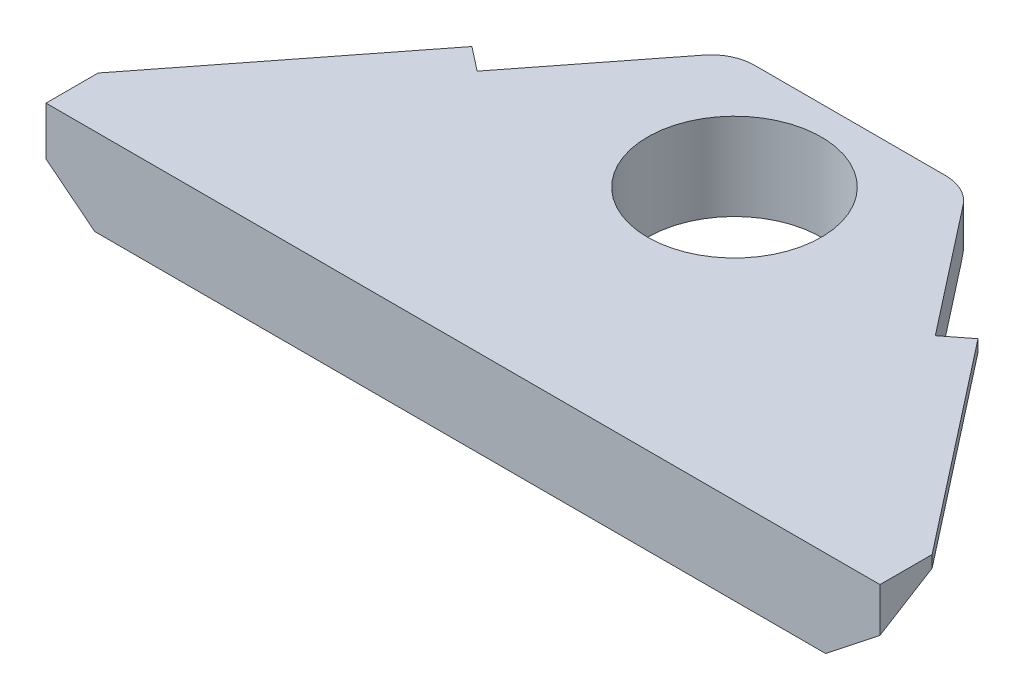
ISO-10303-21;
HEADER;
FILE_DESCRIPTION(('STEP AP214'),'2;1');
FILE_NAME('part.step','',(''),(''),'','','');
FILE_SCHEMA(('AUTOMOTIVE_DESIGN { 1 0 10303 214 1 1 1 1 }'));
ENDSEC;
DATA;
#1=APPLICATION_CONTEXT('core data for automotive mechanical design processes');
#2=APPLICATION_PROTOCOL_DEFINITION('international standard','automotive_design',2000,#1);
#3=PRODUCT_CONTEXT('',#1,'mechanical');
#4=PRODUCT('Part','Part','',(#3));
#5=PRODUCT_RELATED_PRODUCT_CATEGORY('part','',(#4));
#6=PRODUCT_DEFINITION_FORMATION('','',#4);
#7=PRODUCT_DEFINITION_CONTEXT('part definition',#1,'design');
#8=PRODUCT_DEFINITION('design','',#6,#7);
#9=PRODUCT_DEFINITION_SHAPE('','',#8);
#10=(LENGTH_UNIT() NAMED_UNIT(*) SI_UNIT(.MILLI.,.METRE.));
#11=(NAMED_UNIT(*) PLANE_ANGLE_UNIT() SI_UNIT($,.RADIAN.));
#12=(NAMED_UNIT(*) SI_UNIT($,.STERADIAN.) SOLID_ANGLE_UNIT());
#13=UNCERTAINTY_MEASURE_WITH_UNIT(LENGTH_MEASURE(1.E-05),#10,'distance_accuracy_value','');
#14=(GEOMETRIC_REPRESENTATION_CONTEXT(3) GLOBAL_UNCERTAINTY_ASSIGNED_CONTEXT((#13)) GLOBAL_UNIT_ASSIGNED_CONTEXT((#10,
#11,#12)) REPRESENTATION_CONTEXT('',''));
#15=CARTESIAN_POINT('',(0.,0.,0.));
#16=DIRECTION('',(0.,0.,1.));
#17=DIRECTION('',(1.,0.,0.));
#18=AXIS2_PLACEMENT_3D('',#15,#16,#17);
#19=CARTESIAN_POINT('',(-1.12413996809503E-13,20.,-89.1031036090809));
#20=DIRECTION('',(0.,0.,-1.));
#21=DIRECTION('',(-1.,0.,0.));
#22=AXIS2_PLACEMENT_3D('',#19,#20,#21);
#23=PLANE('',#22);
#24=DIRECTION('',(0.,-1.,0.));
#25=VECTOR('',#24,1.);
#26=CARTESIAN_POINT('',(22.,20.,-89.103103609081));
#27=LINE('',#26,#25);
#28=CARTESIAN_POINT('',(22.,20.,-89.103103609081));
#29=VERTEX_POINT('',#28);
#30=CARTESIAN_POINT('',(22.,8.31058830937253,-89.103103609081));
#31=VERTEX_POINT('',#30);
#32=EDGE_CURVE('E208',#29,#31,#27,.T.);
#33=ORIENTED_EDGE('',*,*,#32,.T.);
#34=CARTESIAN_POINT('',(22.,8.31058830937254,-89.1031036090809));
#35=CARTESIAN_POINT('',(21.5516868903119,8.05766600494873,-89.103103609081));
#36=CARTESIAN_POINT('',(21.1011796896838,7.80859694560279,-89.103103609081));
#37=CARTESIAN_POINT('',(20.1943695706919,7.31838547720371,-89.103103609081));
#38=CARTESIAN_POINT('',(19.7380546743511,7.07726523999198,-89.103103609081));
#39=CARTESIAN_POINT('',(18.8197680662028,6.60409199295412,-89.103103609081));
#40=CARTESIAN_POINT('',(18.3577881405278,6.37205489258515,-89.103103609081));
#41=CARTESIAN_POINT('',(17.42829004029,5.91825627754604,-89.103103609081));
#42=CARTESIAN_POINT('',(16.9607672899182,5.69650412074156,-89.1031036090809));
#43=CARTESIAN_POINT('',(16.0202806759605,5.26452050695447,-89.1031036090809));
#44=CARTESIAN_POINT('',(15.5473155061306,5.05429188860836,-89.1031036090809));
#45=CARTESIAN_POINT('',(14.5893472368671,4.64378122629533,-89.1031036090809));
#46=CARTESIAN_POINT('',(14.1042680729476,4.44367628543136,-89.1031036090809));
#47=CARTESIAN_POINT('',(13.1286445249615,4.0580055936524,-89.1031036090809));
#48=CARTESIAN_POINT('',(12.6381031386555,3.87243227724083,-89.1031036090809));
#49=CARTESIAN_POINT('',(11.6516051161092,3.51722856909518,-89.1031036090809));
#50=CARTESIAN_POINT('',(11.1556519732731,3.34758850144394,-89.1031036090809));
#51=CARTESIAN_POINT('',(10.1583774444303,3.02566952124503,-89.1031036090809));
#52=CARTESIAN_POINT('',(9.65705861721339,2.87338270439382,-89.1031036090809));
#53=CARTESIAN_POINT('',(8.64909839127432,2.58758389839375,-89.103103609081));
#54=CARTESIAN_POINT('',(8.14245719327166,2.45407120393947,-89.103103609081));
#55=CARTESIAN_POINT('',(7.15362276805173,2.21440771807101,-89.103103609081));
#56=CARTESIAN_POINT('',(6.67170492434744,2.10712290191107,-89.103103609081));
#57=CARTESIAN_POINT('',(5.70390001426596,1.91167513723405,-89.1031036090809));
#58=CARTESIAN_POINT('',(5.21801223189991,1.82351572071691,-89.1031036090809));
#59=CARTESIAN_POINT('',(4.24300686730657,1.66738982252561,-89.1031036090809));
#60=CARTESIAN_POINT('',(3.75388938192695,1.59942273813876,-89.1031036090809));
#61=CARTESIAN_POINT('',(2.77319701252768,1.48454224188554,-89.1031036090809));
#62=CARTESIAN_POINT('',(2.28162222129823,1.43762804102463,-89.1031036090809));
#63=CARTESIAN_POINT('',(1.30039407269518,1.36573414277388,-89.1031036090809));
#64=CARTESIAN_POINT('',(0.810752049927647,1.34060025240523,-89.1031036090809));
#65=CARTESIAN_POINT('',(-0.169210108173317,1.31204190772287,-89.1031036090809));
#66=CARTESIAN_POINT('',(-0.659530298825745,1.30861934339358,-89.1031036090809));
#67=CARTESIAN_POINT('',(-1.63983560734517,1.32353599176859,-89.1031036090809));
#68=CARTESIAN_POINT('',(-2.12982072694643,1.3418750909725,-89.103103609081));
#69=CARTESIAN_POINT('',(-3.10844785810192,1.40005983310495,-89.1031036090809));
#70=CARTESIAN_POINT('',(-3.59709002505045,1.43990287255807,-89.1031036090808));
#71=CARTESIAN_POINT('',(-4.57080475138942,1.54041804372604,-89.1031036090808));
#72=CARTESIAN_POINT('',(-5.05588352596649,1.60103019640312,-89.1031036090809));
#73=CARTESIAN_POINT('',(-6.02314438434832,1.74234635731469,-89.1031036090809));
#74=CARTESIAN_POINT('',(-6.50532616764961,1.82305241424924,-89.1031036090809));
#75=CARTESIAN_POINT('',(-7.46607724482037,2.00359416431994,-89.1031036090809));
#76=CARTESIAN_POINT('',(-7.94464660990237,2.10342947932709,-89.1031036090809));
#77=CARTESIAN_POINT('',(-8.89768154452408,2.32113554236395,-89.1031036090809));
#78=CARTESIAN_POINT('',(-9.37214673242462,2.43900794897773,-89.1031036090809));
#79=CARTESIAN_POINT('',(-10.7939522737905,2.81931379316332,-89.1031036090809));
#80=CARTESIAN_POINT('',(-11.7344985161579,3.10743590478535,-89.1031036090809));
#81=CARTESIAN_POINT('',(-13.5953892315399,3.74191515827093,-89.1031036090809));
#82=CARTESIAN_POINT('',(-14.515734930398,4.08826875532519,-89.1031036090809));
#83=CARTESIAN_POINT('',(-15.9911064465467,4.68925138008167,-89.1031036090809));
#84=CARTESIAN_POINT('',(-16.5523288638852,4.92886247233152,-89.1031036090809));
#85=CARTESIAN_POINT('',(-17.667207660377,5.42491764430541,-89.1031036090809));
#86=CARTESIAN_POINT('',(-18.2208649115035,5.681359763944,-89.1031036090809));
#87=CARTESIAN_POINT('',(-19.3159614709003,6.20685615065486,-89.1031036090809));
#88=CARTESIAN_POINT('',(-19.8574660490442,6.47577493182386,-89.1031036090809));
#89=CARTESIAN_POINT('',(-20.9337105379841,7.02677988366636,-89.1031036090809));
#90=CARTESIAN_POINT('',(-21.4684507509953,7.30886546341989,-89.1031036090809));
#91=CARTESIAN_POINT('',(-22.,7.596762738856,-89.1031036090809));
#92=B_SPLINE_CURVE_WITH_KNOTS('',3,(#34,#35,#36,#37,#38,#39,#40,#41,#42,#43,#44,#45,#46,#47,#48,
#49,#50,#51,#52,#53,#54,#55,#56,#57,#58,#59,#60,#61,#62,#63,#64,#65,#66,#67,#68,#69,#70,#71,#72,
#73,#74,#75,#76,#77,#78,#79,#80,#81,#82,#83,#84,#85,#86,#87,#88,#89,#90,#91),.UNSPECIFIED.,.F.,
.F.,(4,2,2,2,2,2,2,2,2,2,2,2,2,2,2,2,2,2,2,2,2,2,2,2,2,2,2,2,4),(0.,1.54421854399556,
3.0924317610474,4.64324534578247,6.19544333264359,7.74802197564017,9.3220069215869,
10.8951668901648,12.4673652507412,14.0388445972178,15.6102648906448,17.0910476897978,
18.5721037214584,20.0531155412388,21.5340718528106,23.0044560660705,24.4749682754326,
25.9454728152063,27.4157993613721,28.8819150525468,30.3481802847041,31.8144165361132,
33.280787695031,36.229388986439,39.1778108483309,41.0082464360839,42.838469234342,
44.6520921725371,46.4656337942687),.UNSPECIFIED.);
#93=CARTESIAN_POINT('',(-22.,7.59676273885601,-89.1031036090809));
#94=VERTEX_POINT('',#93);
#95=EDGE_CURVE('E337',#31,#94,#92,.T.);
#96=ORIENTED_EDGE('',*,*,#95,.T.);
#97=DIRECTION('',(0.,-1.,0.));
#98=VECTOR('',#97,1.);
#99=CARTESIAN_POINT('',(-22.,20.,-89.1031036090809));
#100=LINE('',#99,#98);
#101=CARTESIAN_POINT('',(-22.,20.,-89.1031036090809));
#102=VERTEX_POINT('',#101);
#103=EDGE_CURVE('E183',#102,#94,#100,.T.);
#104=ORIENTED_EDGE('',*,*,#103,.F.);
#105=DIRECTION('',(1.,0.,0.));
#106=VECTOR('',#105,1.);
#107=CARTESIAN_POINT('',(-1.12413996809503E-13,20.,-89.1031036090809));
#108=LINE('',#107,#106);
#109=EDGE_CURVE('E201',#102,#29,#108,.T.);
#110=ORIENTED_EDGE('',*,*,#109,.T.);
#111=EDGE_LOOP('',(#33,#96,#104,#110));
#112=FACE_BOUND('',#111,.T.);
#113=ADVANCED_FACE('F35',(#112),#23,.T.);
#114=CARTESIAN_POINT('',(-22.,20.,-79.103103609081));
#115=DIRECTION('',(0.,-1.,0.));
#116=DIRECTION('',(0.,0.,-1.));
#117=AXIS2_PLACEMENT_3D('',#114,#115,#116);
#118=CYLINDRICAL_SURFACE('',#117,9.99999999999996);
#119=ORIENTED_EDGE('',*,*,#103,.T.);
#120=CARTESIAN_POINT('',(-22.,7.59676273885604,-89.1031036090809));
#121=CARTESIAN_POINT('',(-22.15643262679,7.68149996294082,-89.1031058562871));
#122=CARTESIAN_POINT('',(-22.3138978579587,7.76436440666731,-89.0994328312014));
#123=CARTESIAN_POINT('',(-22.6306646345165,7.92613636200172,-89.0844569779342));
#124=CARTESIAN_POINT('',(-22.7899676970097,8.00504026647464,-89.0731473253131));
#125=CARTESIAN_POINT('',(-23.1099415912795,8.15854707675892,-89.0426139989256));
#126=CARTESIAN_POINT('',(-23.2706127682739,8.23314885773725,-89.0233882660208));
#127=CARTESIAN_POINT('',(-23.5937801322642,8.37814635655076,-88.9766375370304));
#128=CARTESIAN_POINT('',(-23.756281500861,8.44851541946785,-88.9490654501955));
#129=CARTESIAN_POINT('',(-24.0816718572253,8.58425058653898,-88.8854405741208));
#130=CARTESIAN_POINT('',(-24.2445607419611,8.64961789421105,-88.8493898335659));
#131=CARTESIAN_POINT('',(-24.5702245221862,8.77504882818991,-88.7686138718));
#132=CARTESIAN_POINT('',(-24.7329994238043,8.83511276553482,-88.7238891598024));
#133=CARTESIAN_POINT('',(-25.0588831489083,8.94998427325665,-88.6253088741702));
#134=CARTESIAN_POINT('',(-25.2219876869424,9.00475659543627,-88.5713979088625));
#135=CARTESIAN_POINT('',(-25.5468854282463,9.1083057390864,-88.454542483566));
#136=CARTESIAN_POINT('',(-25.7086784967113,9.15708195134228,-88.391597107072));
#137=CARTESIAN_POINT('',(-26.030267518421,9.24833248033579,-88.2566467278765));
#138=CARTESIAN_POINT('',(-26.1900633742669,9.2908064908213,-88.1846412852198));
#139=CARTESIAN_POINT('',(-26.5063042146611,9.36901132269758,-88.0319293736593));
#140=CARTESIAN_POINT('',(-26.662760068624,9.40476850733653,-87.9512589624878));
#141=CARTESIAN_POINT('',(-26.972250501057,9.46949986003697,-87.7811164427654));
#142=CARTESIAN_POINT('',(-27.1252851787173,9.49847422498435,-87.6916445898023));
#143=CARTESIAN_POINT('',(-27.4271873303736,9.54942595724056,-87.5041277771909));
#144=CARTESIAN_POINT('',(-27.5760554000586,9.57140432945694,-87.4060840513916));
#145=CARTESIAN_POINT('',(-27.8573811892386,9.6067531108895,-87.2097765738068));
#146=CARTESIAN_POINT('',(-27.9902079301624,9.62066515471416,-87.1121383491966));
#147=CARTESIAN_POINT('',(-28.2511779389863,9.64232276860949,-86.9101515698974));
#148=CARTESIAN_POINT('',(-28.379321338654,9.65006851229904,-86.8058032042293));
#149=CARTESIAN_POINT('',(-28.6304048546391,9.65934140862808,-86.5907636007179));
#150=CARTESIAN_POINT('',(-28.7533449782892,9.66086857003142,-86.4800723718138));
#151=CARTESIAN_POINT('',(-28.994603455173,9.65768056126977,-86.2517644738187));
#152=CARTESIAN_POINT('',(-29.1128713333717,9.65291007907728,-86.1340952255674));
#153=CARTESIAN_POINT('',(-29.3431819345235,9.63705999888606,-85.8932018162863));
#154=CARTESIAN_POINT('',(-29.4552240809166,9.62597981761629,-85.7699771426806));
#155=CARTESIAN_POINT('',(-29.6727126783481,9.59759148671618,-85.518490179496));
#156=CARTESIAN_POINT('',(-29.7781580628011,9.58028233300486,-85.3902270807179));
#157=CARTESIAN_POINT('',(-29.8801075360672,9.55990129085186,-85.2597183623375));
#158=B_SPLINE_CURVE_WITH_KNOTS('',3,(#120,#121,#122,#123,#124,#125,#126,#127,#128,#129,#130,
#131,#132,#133,#134,#135,#136,#137,#138,#139,#140,#141,#142,#143,#144,#145,#146,#147,#148,#149,
#150,#151,#152,#153,#154,#155,#156,#157),.UNSPECIFIED.,.F.,.F.,(4,2,2,2,2,2,2,2,2,2,2,2,2,2,2,2,
2,2,4),(0.,0.533699589425553,1.06787674953373,1.60219294818595,2.13958183781984,2.6768410121083,
3.21406865564927,3.75465841240523,4.29530304865425,4.83597394864265,5.37447624773547,
5.91296291370445,6.45137219626471,6.94737570355834,7.44336524484069,7.93935408712499,
8.43972829952873,8.94014877422919,9.44064995050896),.UNSPECIFIED.);
#159=CARTESIAN_POINT('',(-29.8801075360672,9.55990129085187,-85.2597183623375));
#160=VERTEX_POINT('',#159);
#161=EDGE_CURVE('E282',#94,#160,#158,.T.);
#162=ORIENTED_EDGE('',*,*,#161,.T.);
#163=DIRECTION('',(0.,-1.,0.));
#164=VECTOR('',#163,1.);
#165=CARTESIAN_POINT('',(-29.8801075360672,20.,-85.2597183623375));
#166=LINE('',#165,#164);
#167=CARTESIAN_POINT('',(-29.8801075360672,20.,-85.2597183623375));
#168=VERTEX_POINT('',#167);
#169=EDGE_CURVE('E180',#168,#160,#166,.T.);
#170=ORIENTED_EDGE('',*,*,#169,.F.);
#171=CARTESIAN_POINT('',(-22.,20.,-79.103103609081));
#172=DIRECTION('',(0.,1.,0.));
#173=DIRECTION('',(0.,0.,1.));
#174=AXIS2_PLACEMENT_3D('',#171,#172,#173);
#175=CIRCLE('',#174,9.99999999999996);
#176=EDGE_CURVE('E242',#168,#102,#175,.F.);
#177=ORIENTED_EDGE('',*,*,#176,.T.);
#178=EDGE_LOOP('',(#119,#162,#170,#177));
#179=FACE_BOUND('',#178,.T.);
#180=ADVANCED_FACE('F280',(#179),#118,.T.);
#181=CARTESIAN_POINT('',(-59.9179500711928,20.,-46.8130331603703));
#182=DIRECTION('',(-0.788010753606721,0.,-0.615661475325659));
#183=DIRECTION('',(-0.615661475325659,0.,0.788010753606721));
#184=AXIS2_PLACEMENT_3D('',#181,#182,#183);
#185=PLANE('',#184);
#186=ORIENTED_EDGE('',*,*,#169,.T.);
#187=CARTESIAN_POINT('',(-29.8801075360672,9.5599012908519,-85.2597183623375));
#188=CARTESIAN_POINT('',(-29.989486319304,9.53804466760884,-85.1197199039941));
#189=CARTESIAN_POINT('',(-30.0989493815241,9.51729867291096,-84.9796135734713));
#190=CARTESIAN_POINT('',(-30.3179559444161,9.47806222493247,-84.6992979559023));
#191=CARTESIAN_POINT('',(-30.4274993452701,9.459570301498,-84.5590887966172));
#192=CARTESIAN_POINT('',(-30.6466674588731,9.42485619250329,-84.2785664035675));
#193=CARTESIAN_POINT('',(-30.7562921041109,9.40863288296598,-84.1382532562133));
#194=CARTESIAN_POINT('',(-30.9756233695458,9.37846861589302,-83.8575220383417));
#195=CARTESIAN_POINT('',(-31.0853299499413,9.36452689504534,-83.7171040187678));
#196=CARTESIAN_POINT('',(-31.3048257393703,9.33893755462954,-83.4361622197866));
#197=CARTESIAN_POINT('',(-31.4146149311578,9.32728954492146,-83.295638462453));
#198=CARTESIAN_POINT('',(-31.6342781559078,9.30629812157011,-83.0144823560337));
#199=CARTESIAN_POINT('',(-31.7441521898835,9.2969547358891,-82.8738500056512));
#200=CARTESIAN_POINT('',(-31.9639835322314,9.28058241555342,-82.5924787185192));
#201=CARTESIAN_POINT('',(-32.0739408512423,9.27355385763578,-82.4517397681528));
#202=CARTESIAN_POINT('',(-32.2939388900874,9.2618196147343,-82.1701551192341));
#203=CARTESIAN_POINT('',(-32.4039796254782,9.2571146989572,-82.0293094007703));
#204=CARTESIAN_POINT('',(-32.6241446139429,9.25003520450631,-81.747511066083));
#205=CARTESIAN_POINT('',(-32.7342688812521,9.24766179334452,-81.6065584316392));
#206=CARTESIAN_POINT('',(-32.9546010265122,9.24525084971135,-81.3245461460104));
#207=CARTESIAN_POINT('',(-33.0648089109692,9.24521488619569,-81.1834864864979));
#208=CARTESIAN_POINT('',(-33.1750122410625,9.24634995978794,-81.0424326563053));
#209=B_SPLINE_CURVE_WITH_KNOTS('',3,(#187,#188,#189,#190,#191,#192,#193,#194,#195,#196,#197,
#198,#199,#200,#201,#202,#203,#204,#205,#206,#207,#208),.UNSPECIFIED.,.F.,.F.,(4,2,2,2,2,2,2,2,
2,2,4),(0.,0.5369968662186,1.07364159589294,1.61001949752742,2.14621758392513,2.68232438884775,
3.21843769809506,3.75463821644629,4.29101611713117,4.8276624748869,5.36466903993515),.UNSPECIFIED.);
#210=CARTESIAN_POINT('',(-33.1750122410625,9.2463499597879,-81.0424326563053));
#211=VERTEX_POINT('',#210);
#212=EDGE_CURVE('E286',#160,#211,#209,.T.);
#213=ORIENTED_EDGE('',*,*,#212,.T.);
#214=DIRECTION('',(-0.615661475325659,0.,0.788010753606721));
#215=VECTOR('',#214,1.);
#216=CARTESIAN_POINT('',(-59.9179500711929,9.24634995978806,-46.8130331603702));
#217=LINE('',#216,#215);
#218=CARTESIAN_POINT('',(-52.7403049281963,9.24634995978801,-56.));
#219=VERTEX_POINT('',#218);
#220=EDGE_CURVE('E302',#211,#219,#217,.T.);
#221=ORIENTED_EDGE('',*,*,#220,.T.);
#222=DIRECTION('',(0.,-1.,0.));
#223=VECTOR('',#222,1.);
#224=CARTESIAN_POINT('',(-52.7403049281963,20.,-56.));
#225=LINE('',#224,#223);
#226=CARTESIAN_POINT('',(-52.7403049281963,20.,-56.));
#227=VERTEX_POINT('',#226);
#228=EDGE_CURVE('E177',#227,#219,#225,.T.);
#229=ORIENTED_EDGE('',*,*,#228,.F.);
#230=DIRECTION('',(0.615661475325659,0.,-0.788010753606721));
#231=VECTOR('',#230,1.);
#232=CARTESIAN_POINT('',(-59.9179500711928,20.,-46.8130331603703));
#233=LINE('',#232,#231);
#234=EDGE_CURVE('E245',#227,#168,#233,.T.);
#235=ORIENTED_EDGE('',*,*,#234,.T.);
#236=EDGE_LOOP('',(#186,#213,#221,#229,#235));
#237=FACE_BOUND('',#236,.T.);
#238=ADVANCED_FACE('F284',(#237),#185,.T.);
#239=CARTESIAN_POINT('',(7.17764514299657,20.,-9.18696683962971));
#240=DIRECTION('',(0.61566147532566,0.,-0.788010753606721));
#241=DIRECTION('',(-0.788010753606721,0.,-0.61566147532566));
#242=AXIS2_PLACEMENT_3D('',#239,#240,#241);
#243=PLANE('',#242);
#244=ORIENTED_EDGE('',*,*,#228,.T.);
#245=DIRECTION('',(-0.557140014624276,0.707192725021949,-0.435285485377691));
#246=VECTOR('',#245,1.);
#247=CARTESIAN_POINT('',(-27.025608749749,-23.3940018121295,-35.9094774857918));
#248=LINE('',#247,#246);
#249=CARTESIAN_POINT('',(-58.2563802034433,16.2480518712166,-60.3096303272796));
#250=VERTEX_POINT('',#249);
#251=EDGE_CURVE('E292',#219,#250,#248,.T.);
#252=ORIENTED_EDGE('',*,*,#251,.T.);
#253=DIRECTION('',(0.,-1.,0.));
#254=VECTOR('',#253,1.);
#255=CARTESIAN_POINT('',(-58.2563802034433,20.,-60.3096303272796));
#256=LINE('',#255,#254);
#257=CARTESIAN_POINT('',(-58.2563802034433,20.,-60.3096303272796));
#258=VERTEX_POINT('',#257);
#259=EDGE_CURVE('E168',#258,#250,#256,.T.);
#260=ORIENTED_EDGE('',*,*,#259,.F.);
#261=DIRECTION('',(0.788010753606721,0.,0.61566147532566));
#262=VECTOR('',#261,1.);
#263=CARTESIAN_POINT('',(7.17764514299657,20.,-9.18696683962971));
#264=LINE('',#263,#262);
#265=EDGE_CURVE('E248',#258,#227,#264,.T.);
#266=ORIENTED_EDGE('',*,*,#265,.T.);
#267=EDGE_LOOP('',(#244,#252,#260,#266));
#268=FACE_BOUND('',#267,.T.);
#269=ADVANCED_FACE('F290',(#268),#243,.T.);
#270=CARTESIAN_POINT('',(-65.4340253464399,20.,-51.1226634876499));
#271=DIRECTION('',(-0.788010753606721,0.,-0.61566147532566));
#272=DIRECTION('',(-0.61566147532566,0.,0.788010753606721));
#273=AXIS2_PLACEMENT_3D('',#270,#271,#272);
#274=PLANE('',#273);
#275=ORIENTED_EDGE('',*,*,#259,.T.);
#276=DIRECTION('',(-0.61566147532566,0.,0.788010753606721));
#277=VECTOR('',#276,1.);
#278=CARTESIAN_POINT('',(-65.4340253464399,16.2480518712167,-51.1226634876499));
#279=LINE('',#278,#277);
#280=CARTESIAN_POINT('',(-96.,16.2480518712169,-12.));
#281=VERTEX_POINT('',#280);
#282=EDGE_CURVE('E159',#250,#281,#279,.T.);
#283=ORIENTED_EDGE('',*,*,#282,.T.);
#284=DIRECTION('',(0.,-1.,0.));
#285=VECTOR('',#284,1.);
#286=CARTESIAN_POINT('',(-96.,20.,-12.));
#287=LINE('',#286,#285);
#288=CARTESIAN_POINT('',(-96.,20.,-12.));
#289=VERTEX_POINT('',#288);
#290=EDGE_CURVE('E158',#289,#281,#287,.T.);
#291=ORIENTED_EDGE('',*,*,#290,.F.);
#292=DIRECTION('',(0.61566147532566,0.,-0.788010753606721));
#293=VECTOR('',#292,1.);
#294=CARTESIAN_POINT('',(-65.4340253464399,20.,-51.1226634876499));
#295=LINE('',#294,#293);
#296=EDGE_CURVE('E251',#289,#258,#295,.T.);
#297=ORIENTED_EDGE('',*,*,#296,.T.);
#298=EDGE_LOOP('',(#275,#283,#291,#297));
#299=FACE_BOUND('',#298,.T.);
#300=ADVANCED_FACE('F294',(#299),#274,.T.);
#301=CARTESIAN_POINT('',(-96.,20.,0.));
#302=DIRECTION('',(-1.,0.,0.));
#303=DIRECTION('',(0.,0.,1.));
#304=AXIS2_PLACEMENT_3D('',#301,#302,#303);
#305=PLANE('',#304);
#306=ORIENTED_EDGE('',*,*,#290,.T.);
#307=DIRECTION('',(0.,-0.524360839057427,0.851496159981354));
#308=VECTOR('',#307,1.);
#309=CARTESIAN_POINT('',(-96.,11.9217712125221,-4.97466345026443));
#310=LINE('',#309,#308);
#311=CARTESIAN_POINT('',(-96.,8.85831793650727,0.));
#312=VERTEX_POINT('',#311);
#313=EDGE_CURVE('E143',#281,#312,#310,.T.);
#314=ORIENTED_EDGE('',*,*,#313,.T.);
#315=DIRECTION('',(0.,-1.,0.));
#316=VECTOR('',#315,1.);
#317=CARTESIAN_POINT('',(-96.,20.,0.));
#318=LINE('',#317,#316);
#319=CARTESIAN_POINT('',(-96.,20.,0.));
#320=VERTEX_POINT('',#319);
#321=EDGE_CURVE('E156',#320,#312,#318,.T.);
#322=ORIENTED_EDGE('',*,*,#321,.F.);
#323=DIRECTION('',(0.,0.,-1.));
#324=VECTOR('',#323,1.);
#325=CARTESIAN_POINT('',(-96.,20.,0.));
#326=LINE('',#325,#324);
#327=EDGE_CURVE('E254',#320,#289,#326,.T.);
#328=ORIENTED_EDGE('',*,*,#327,.T.);
#329=EDGE_LOOP('',(#306,#314,#322,#328));
#330=FACE_BOUND('',#329,.T.);
#331=ADVANCED_FACE('F154',(#330),#305,.T.);
#332=CARTESIAN_POINT('',(0.,20.,0.));
#333=DIRECTION('',(0.,0.,-1.));
#334=DIRECTION('',(-1.,0.,0.));
#335=AXIS2_PLACEMENT_3D('',#332,#333,#334);
#336=PLANE('',#335);
#337=DIRECTION('',(0.785368129012437,0.619028999265385,0.));
#338=VECTOR('',#337,1.);
#339=CARTESIAN_POINT('',(121.67703002283,30.11437676729,0.));
#340=LINE('',#339,#338);
#341=CARTESIAN_POINT('',(83.4706265002667,0.,0.));
#342=VERTEX_POINT('',#341);
#343=CARTESIAN_POINT('',(96.,9.87568154658253,0.));
#344=VERTEX_POINT('',#343);
#345=EDGE_CURVE('E295',#342,#344,#340,.T.);
#346=ORIENTED_EDGE('',*,*,#345,.T.);
#347=DIRECTION('',(0.,-1.,0.));
#348=VECTOR('',#347,1.);
#349=CARTESIAN_POINT('',(96.,20.,0.));
#350=LINE('',#349,#348);
#351=CARTESIAN_POINT('',(96.,20.,0.));
#352=VERTEX_POINT('',#351);
#353=EDGE_CURVE('E166',#352,#344,#350,.T.);
#354=ORIENTED_EDGE('',*,*,#353,.F.);
#355=DIRECTION('',(1.,0.,0.));
#356=VECTOR('',#355,1.);
#357=CARTESIAN_POINT('',(0.,20.,0.));
#358=LINE('',#357,#356);
#359=EDGE_CURVE('E164',#320,#352,#358,.T.);
#360=ORIENTED_EDGE('',*,*,#359,.F.);
#361=ORIENTED_EDGE('',*,*,#321,.T.);
#362=DIRECTION('',(0.785368129012435,-0.619028999265387,0.));
#363=VECTOR('',#362,1.);
#364=CARTESIAN_POINT('',(-77.4675015359405,-5.74904077121089,0.));
#365=LINE('',#364,#363);
#366=CARTESIAN_POINT('',(-84.7613656351349,0.,0.));
#367=VERTEX_POINT('',#366);
#368=EDGE_CURVE('E140',#312,#367,#365,.T.);
#369=ORIENTED_EDGE('',*,*,#368,.T.);
#370=DIRECTION('',(1.,0.,0.));
#371=VECTOR('',#370,1.);
#372=CARTESIAN_POINT('',(0.,0.,0.));
#373=LINE('',#372,#371);
#374=EDGE_CURVE('E196',#367,#342,#373,.T.);
#375=ORIENTED_EDGE('',*,*,#374,.T.);
#376=EDGE_LOOP('',(#346,#354,#360,#361,#369,#375));
#377=FACE_BOUND('',#376,.T.);
#378=ADVANCED_FACE('F162',(#377),#336,.F.);
#379=CARTESIAN_POINT('',(96.,20.,0.));
#380=DIRECTION('',(1.,0.,0.));
#381=DIRECTION('',(0.,0.,-1.));
#382=AXIS2_PLACEMENT_3D('',#379,#380,#381);
#383=PLANE('',#382);
#384=ORIENTED_EDGE('',*,*,#353,.T.);
#385=DIRECTION('',(0.,0.524360839057431,-0.851496159981351));
#386=VECTOR('',#385,1.);
#387=CARTESIAN_POINT('',(96.,12.6594063339884,-4.52041950955341));
#388=LINE('',#387,#386);
#389=CARTESIAN_POINT('',(96.,17.2654154812922,-12.));
#390=VERTEX_POINT('',#389);
#391=EDGE_CURVE('E204',#344,#390,#388,.T.);
#392=ORIENTED_EDGE('',*,*,#391,.T.);
#393=DIRECTION('',(0.,-1.,0.));
#394=VECTOR('',#393,1.);
#395=CARTESIAN_POINT('',(96.,20.,-12.));
#396=LINE('',#395,#394);
#397=CARTESIAN_POINT('',(96.,20.,-12.));
#398=VERTEX_POINT('',#397);
#399=EDGE_CURVE('E171',#398,#390,#396,.T.);
#400=ORIENTED_EDGE('',*,*,#399,.F.);
#401=DIRECTION('',(0.,0.,1.));
#402=VECTOR('',#401,1.);
#403=CARTESIAN_POINT('',(96.,20.,0.));
#404=LINE('',#403,#402);
#405=EDGE_CURVE('E233',#398,#352,#404,.T.);
#406=ORIENTED_EDGE('',*,*,#405,.T.);
#407=EDGE_LOOP('',(#384,#392,#400,#406));
#408=FACE_BOUND('',#407,.T.);
#409=ADVANCED_FACE('F232',(#408),#383,.T.);
#410=CARTESIAN_POINT('',(65.4340253464399,20.,-51.1226634876499));
#411=DIRECTION('',(-0.788010753606721,0.,0.615661475325659));
#412=DIRECTION('',(0.615661475325659,0.,0.788010753606721));
#413=AXIS2_PLACEMENT_3D('',#410,#411,#412);
#414=PLANE('',#413);
#415=DIRECTION('',(0.615661475325659,0.,0.788010753606721));
#416=VECTOR('',#415,1.);
#417=CARTESIAN_POINT('',(65.4340253464399,17.2654154812924,-51.1226634876499));
#418=LINE('',#417,#416);
#419=CARTESIAN_POINT('',(58.2563802034433,17.2654154812924,-60.3096303272796));
#420=VERTEX_POINT('',#419);
#421=EDGE_CURVE('E225',#420,#390,#418,.T.);
#422=ORIENTED_EDGE('',*,*,#421,.F.);
#423=DIRECTION('',(0.,-1.,0.));
#424=VECTOR('',#423,1.);
#425=CARTESIAN_POINT('',(58.2563802034433,20.,-60.3096303272796));
#426=LINE('',#425,#424);
#427=CARTESIAN_POINT('',(58.2563802034433,20.,-60.3096303272796));
#428=VERTEX_POINT('',#427);
#429=EDGE_CURVE('E217',#428,#420,#426,.T.);
#430=ORIENTED_EDGE('',*,*,#429,.F.);
#431=DIRECTION('',(-0.615661475325659,0.,-0.788010753606721));
#432=VECTOR('',#431,1.);
#433=CARTESIAN_POINT('',(65.4340253464399,20.,-51.1226634876499));
#434=LINE('',#433,#432);
#435=EDGE_CURVE('E227',#398,#428,#434,.T.);
#436=ORIENTED_EDGE('',*,*,#435,.F.);
#437=ORIENTED_EDGE('',*,*,#399,.T.);
#438=EDGE_LOOP('',(#422,#430,#436,#437));
#439=FACE_BOUND('',#438,.T.);
#440=ADVANCED_FACE('F223',(#439),#414,.F.);
#441=CARTESIAN_POINT('',(-7.17764514299657,20.,-9.18696683962971));
#442=DIRECTION('',(0.61566147532566,0.,0.788010753606721));
#443=DIRECTION('',(0.788010753606721,0.,-0.61566147532566));
#444=AXIS2_PLACEMENT_3D('',#441,#442,#443);
#445=PLANE('',#444);
#446=DIRECTION('',(0.557140014624276,0.707192725021949,-0.435285485377691));
#447=VECTOR('',#446,1.);
#448=CARTESIAN_POINT('',(26.6247620290596,-22.885443667968,-35.5963017044849));
#449=LINE('',#448,#447);
#450=CARTESIAN_POINT('',(52.7403049281963,10.2637135698638,-56.));
#451=VERTEX_POINT('',#450);
#452=EDGE_CURVE('E236',#451,#420,#449,.T.);
#453=ORIENTED_EDGE('',*,*,#452,.F.);
#454=DIRECTION('',(0.,-1.,0.));
#455=VECTOR('',#454,1.);
#456=CARTESIAN_POINT('',(52.7403049281963,20.,-56.));
#457=LINE('',#456,#455);
#458=CARTESIAN_POINT('',(52.7403049281963,20.,-56.));
#459=VERTEX_POINT('',#458);
#460=EDGE_CURVE('E214',#459,#451,#457,.T.);
#461=ORIENTED_EDGE('',*,*,#460,.F.);
#462=DIRECTION('',(-0.788010753606721,0.,0.61566147532566));
#463=VECTOR('',#462,1.);
#464=CARTESIAN_POINT('',(-7.17764514299657,20.,-9.18696683962971));
#465=LINE('',#464,#463);
#466=EDGE_CURVE('E259',#428,#459,#465,.T.);
#467=ORIENTED_EDGE('',*,*,#466,.F.);
#468=ORIENTED_EDGE('',*,*,#429,.T.);
#469=EDGE_LOOP('',(#453,#461,#467,#468));
#470=FACE_BOUND('',#469,.T.);
#471=ADVANCED_FACE('F407',(#470),#445,.F.);
#472=CARTESIAN_POINT('',(59.9179500711929,20.,-46.8130331603702));
#473=DIRECTION('',(-0.788010753606721,0.,0.615661475325659));
#474=DIRECTION('',(0.615661475325659,0.,0.788010753606721));
#475=AXIS2_PLACEMENT_3D('',#472,#473,#474);
#476=PLANE('',#475);
#477=DIRECTION('',(0.615661475325659,0.,0.788010753606721));
#478=VECTOR('',#477,1.);
#479=CARTESIAN_POINT('',(59.9179500711929,10.2637135698638,-46.8130331603703));
#480=LINE('',#479,#478);
#481=CARTESIAN_POINT('',(32.351403137189,10.263713569864,-82.0966042370062));
#482=VERTEX_POINT('',#481);
#483=EDGE_CURVE('E517',#482,#451,#480,.T.);
#484=ORIENTED_EDGE('',*,*,#483,.F.);
#485=CARTESIAN_POINT('',(29.8801075360672,10.4815212396571,-85.2597183623376));
#486=CARTESIAN_POINT('',(29.9827899777378,10.4645823770315,-85.1282908303481));
#487=CARTESIAN_POINT('',(30.0855329585953,10.4486102002498,-84.996785811733));
#488=CARTESIAN_POINT('',(30.2910838233584,10.4186193417133,-84.7336927023895));
#489=CARTESIAN_POINT('',(30.3938916624709,10.4045998499004,-84.6021046689936));
#490=CARTESIAN_POINT('',(30.5995727543312,10.3785240152393,-84.3388448765666));
#491=CARTESIAN_POINT('',(30.702445980719,10.3664671240627,-84.2071731512748));
#492=CARTESIAN_POINT('',(30.9082582277454,10.3443249292658,-83.9437454878905));
#493=CARTESIAN_POINT('',(31.0111972370169,10.334239346959,-83.8119895643473));
#494=CARTESIAN_POINT('',(31.2171419656239,10.3160475212247,-83.5483923322725));
#495=CARTESIAN_POINT('',(31.320147685228,10.3079412858162,-83.4165510233971));
#496=CARTESIAN_POINT('',(31.5262253839158,10.2937151787381,-83.1527835973802));
#497=CARTESIAN_POINT('',(31.6292973701909,10.2875955818382,-83.0208574710337));
#498=CARTESIAN_POINT('',(31.8355077179506,10.2773490343994,-82.7569202619471));
#499=CARTESIAN_POINT('',(31.9386460899341,10.2732226411067,-82.6249091657688));
#500=CARTESIAN_POINT('',(32.1449892907968,10.2669674165829,-82.3608019124646));
#501=CARTESIAN_POINT('',(32.2481941293608,10.2648394283419,-82.2287057429428));
#502=CARTESIAN_POINT('',(32.351403137189,10.2637135698639,-82.0966042370062));
#503=B_SPLINE_CURVE_WITH_KNOTS('',3,(#485,#486,#487,#488,#489,#490,#491,#492,#493,#494,#495,
#496,#497,#498,#499,#500,#501,#502),.UNSPECIFIED.,.F.,.F.,(4,2,2,2,2,2,2,2,4),(0.,
0.502923095615045,1.00563693158517,1.5082100730125,2.01071211355282,2.51321618986612,
3.01578973737211,3.51850370976891,4.02142964762128),.UNSPECIFIED.);
#504=CARTESIAN_POINT('',(29.8801075360672,10.4815212396571,-85.2597183623375));
#505=VERTEX_POINT('',#504);
#506=EDGE_CURVE('E270',#505,#482,#503,.T.);
#507=ORIENTED_EDGE('',*,*,#506,.F.);
#508=DIRECTION('',(0.,-1.,0.));
#509=VECTOR('',#508,1.);
#510=CARTESIAN_POINT('',(29.8801075360672,20.,-85.2597183623376));
#511=LINE('',#510,#509);
#512=CARTESIAN_POINT('',(29.8801075360672,20.,-85.2597183623376));
#513=VERTEX_POINT('',#512);
#514=EDGE_CURVE('E211',#513,#505,#511,.T.);
#515=ORIENTED_EDGE('',*,*,#514,.F.);
#516=DIRECTION('',(-0.615661475325659,0.,-0.788010753606721));
#517=VECTOR('',#516,1.);
#518=CARTESIAN_POINT('',(59.9179500711929,20.,-46.8130331603702));
#519=LINE('',#518,#517);
#520=EDGE_CURVE('E262',#459,#513,#519,.T.);
#521=ORIENTED_EDGE('',*,*,#520,.F.);
#522=ORIENTED_EDGE('',*,*,#460,.T.);
#523=EDGE_LOOP('',(#484,#507,#515,#521,#522));
#524=FACE_BOUND('',#523,.T.);
#525=ADVANCED_FACE('F269',(#524),#476,.F.);
#526=CARTESIAN_POINT('',(22.,20.,-79.103103609081));
#527=DIRECTION('',(0.,-1.,0.));
#528=DIRECTION('',(0.,0.,-1.));
#529=AXIS2_PLACEMENT_3D('',#526,#527,#528);
#530=CYLINDRICAL_SURFACE('',#529,10.);
#531=CARTESIAN_POINT('',(22.,8.31058830937253,-89.103103609081));
#532=CARTESIAN_POINT('',(22.1578848772755,8.39966837265366,-89.1031055111076));
#533=CARTESIAN_POINT('',(22.3168355445877,8.48689333609524,-89.0993643348251));
#534=CARTESIAN_POINT('',(22.6366481711911,8.65741813159215,-89.0841016746914));
#535=CARTESIAN_POINT('',(22.7975117807444,8.7407142119168,-89.0725729091067));
#536=CARTESIAN_POINT('',(23.1206772820256,8.9030206477132,-89.0414355619791));
#537=CARTESIAN_POINT('',(23.282979556297,8.98202982093872,-89.0218247642561));
#538=CARTESIAN_POINT('',(23.6096399377961,9.13593901254002,-88.9740957833186));
#539=CARTESIAN_POINT('',(23.774004533196,9.21080794594003,-88.9459214699161));
#540=CARTESIAN_POINT('',(24.1031830737744,9.3555125940297,-88.8808722905264));
#541=CARTESIAN_POINT('',(24.2679968957358,9.42534956804509,-88.8439996113821));
#542=CARTESIAN_POINT('',(24.5975653624552,9.55966968472707,-88.761339131468));
#543=CARTESIAN_POINT('',(24.7623200101734,9.62415314878624,-88.7155518664293));
#544=CARTESIAN_POINT('',(25.0922629263808,9.74783341616203,-88.6145634220059));
#545=CARTESIAN_POINT('',(25.2574470010672,9.80699294773749,-88.5593027218636));
#546=CARTESIAN_POINT('',(25.5865289298445,9.91920986178939,-88.4394560382582));
#547=CARTESIAN_POINT('',(25.7504266462965,9.97226659934916,-88.3748690708595));
#548=CARTESIAN_POINT('',(26.076227274879,10.0719398455418,-88.2363235696864));
#549=CARTESIAN_POINT('',(26.2381300653742,10.1185559632276,-88.1623644675432));
#550=CARTESIAN_POINT('',(26.5584651862401,10.2048333108771,-88.0054660805477));
#551=CARTESIAN_POINT('',(26.7169098925065,10.2445250152852,-87.922568883457));
#552=CARTESIAN_POINT('',(27.0303149749771,10.3169248376031,-87.7476472496943));
#553=CARTESIAN_POINT('',(27.1852754927921,10.3496332398014,-87.6556231847985));
#554=CARTESIAN_POINT('',(27.4909236048237,10.4078165118785,-87.4626735799236));
#555=CARTESIAN_POINT('',(27.6416119912633,10.4332927308942,-87.3617497047811));
#556=CARTESIAN_POINT('',(27.919961297661,10.4741735639487,-87.1640932047087));
#557=CARTESIAN_POINT('',(28.0481956222452,10.4904257725197,-87.0683411059825));
#558=CARTESIAN_POINT('',(28.3002818191458,10.5170972677557,-86.8704788920066));
#559=CARTESIAN_POINT('',(28.4241340115789,10.5275169813149,-86.7683692426893));
#560=CARTESIAN_POINT('',(28.6669721959243,10.5424573425739,-86.5581203228448));
#561=CARTESIAN_POINT('',(28.7859583817994,10.5469782256284,-86.4499812930605));
#562=CARTESIAN_POINT('',(29.0196417290233,10.5501067458461,-86.2270727433869));
#563=CARTESIAN_POINT('',(29.1342919518398,10.5486620143507,-86.1122532636725));
#564=CARTESIAN_POINT('',(29.3577713278685,10.5397476285122,-85.8772809075289));
#565=CARTESIAN_POINT('',(29.4665997618161,10.5322772315408,-85.7571273754335));
#566=CARTESIAN_POINT('',(29.6780835584517,10.5113650735655,-85.5119496331032));
#567=CARTESIAN_POINT('',(29.7807373412614,10.4979217916251,-85.3869241896865));
#568=CARTESIAN_POINT('',(29.8801075360672,10.4815212396571,-85.2597183623375));
#569=B_SPLINE_CURVE_WITH_KNOTS('',3,(#531,#532,#533,#534,#535,#536,#537,#538,#539,#540,#541,
#542,#543,#544,#545,#546,#547,#548,#549,#550,#551,#552,#553,#554,#555,#556,#557,#558,#559,#560,
#561,#562,#563,#564,#565,#566,#567,#568),.UNSPECIFIED.,.F.,.F.,(4,2,2,2,2,2,2,2,2,2,2,2,2,2,2,2,
2,2,4),(0.,0.543817352895823,1.08814390375766,1.6326198142447,2.18074444202218,2.72873141320308,
3.27668546271414,3.82821767126414,4.37980810989245,4.93143201549505,5.48056336304889,
6.02967235132557,6.57867883793321,7.06098374655127,7.54325334951092,8.02550371003802,
8.51199642506327,8.99854910664853,9.48522575516235),.UNSPECIFIED.);
#570=EDGE_CURVE('E274',#31,#505,#569,.T.);
#571=ORIENTED_EDGE('',*,*,#570,.F.);
#572=ORIENTED_EDGE('',*,*,#32,.F.);
#573=CARTESIAN_POINT('',(22.,20.,-79.103103609081));
#574=DIRECTION('',(0.,1.,0.));
#575=DIRECTION('',(0.,0.,1.));
#576=AXIS2_PLACEMENT_3D('',#573,#574,#575);
#577=CIRCLE('',#576,10.);
#578=EDGE_CURVE('E58',#513,#29,#577,.T.);
#579=ORIENTED_EDGE('',*,*,#578,.F.);
#580=ORIENTED_EDGE('',*,*,#514,.T.);
#581=EDGE_LOOP('',(#571,#572,#579,#580));
#582=FACE_BOUND('',#581,.T.);
#583=ADVANCED_FACE('F273',(#582),#530,.T.);
#584=CARTESIAN_POINT('',(0.,0.,0.));
#585=DIRECTION('',(0.,1.,0.));
#586=DIRECTION('',(0.,0.,1.));
#587=AXIS2_PLACEMENT_3D('',#584,#585,#586);
#588=PLANE('',#587);
#589=CARTESIAN_POINT('',(0.,0.,-62.5));
#590=DIRECTION('',(0.,1.,0.));
#591=DIRECTION('',(0.,0.,1.));
#592=AXIS2_PLACEMENT_3D('',#589,#590,#591);
#593=CIRCLE('',#592,20.);
#594=CARTESIAN_POINT('',(0.,0.,-42.5));
#595=VERTEX_POINT('',#594);
#596=EDGE_CURVE('E198',#595,#595,#593,.T.);
#597=ORIENTED_EDGE('',*,*,#596,.T.);
#598=EDGE_LOOP('',(#597));
#599=FACE_BOUND('',#598,.T.);
#600=DIRECTION('',(-0.615661475325662,0.,-0.788010753606719));
#601=VECTOR('',#600,1.);
#602=CARTESIAN_POINT('',(51.8319993450511,0.,-40.4955960813944));
#603=LINE('',#602,#601);
#604=CARTESIAN_POINT('',(24.4047686611128,0.,-75.6008504895302));
#605=VERTEX_POINT('',#604);
#606=EDGE_CURVE('E11',#342,#605,#603,.T.);
#607=ORIENTED_EDGE('',*,*,#606,.F.);
#608=ORIENTED_EDGE('',*,*,#374,.F.);
#609=DIRECTION('',(-0.615661475325656,0.,0.788010753606723));
#610=VECTOR('',#609,1.);
#611=CARTESIAN_POINT('',(-52.6334979416019,0.,-41.1217954145442));
#612=LINE('',#611,#610);
#613=CARTESIAN_POINT('',(-25.765053218238,0.,-75.5118364082562));
#614=VERTEX_POINT('',#613);
#615=EDGE_CURVE('E146',#614,#367,#612,.T.);
#616=ORIENTED_EDGE('',*,*,#615,.F.);
#617=CARTESIAN_POINT('',(-0.645369567434587,0.,-55.9578630895237));
#618=DIRECTION('',(0.,1.,0.));
#619=DIRECTION('',(-1.,0.,0.));
#620=AXIS2_PLACEMENT_3D('',#617,#618,#619);
#621=CIRCLE('',#620,31.8332590110743);
#622=EDGE_CURVE('E43',#605,#614,#621,.T.);
#623=ORIENTED_EDGE('',*,*,#622,.F.);
#624=EDGE_LOOP('',(#607,#608,#616,#623));
#625=FACE_BOUND('',#624,.T.);
#626=ADVANCED_FACE('F195',(#599,#625),#588,.F.);
#627=CARTESIAN_POINT('',(0.,20.,-62.5));
#628=DIRECTION('',(0.,-1.,0.));
#629=DIRECTION('',(0.,0.,-1.));
#630=AXIS2_PLACEMENT_3D('',#627,#628,#629);
#631=CYLINDRICAL_SURFACE('',#630,20.);
#632=CARTESIAN_POINT('',(0.,20.,-62.5));
#633=DIRECTION('',(0.,1.,0.));
#634=DIRECTION('',(0.,0.,1.));
#635=AXIS2_PLACEMENT_3D('',#632,#633,#634);
#636=CIRCLE('',#635,20.);
#637=CARTESIAN_POINT('',(0.,20.,-42.5));
#638=VERTEX_POINT('',#637);
#639=EDGE_CURVE('E197',#638,#638,#636,.T.);
#640=ORIENTED_EDGE('',*,*,#639,.T.);
#641=EDGE_LOOP('',(#640));
#642=FACE_BOUND('',#641,.T.);
#643=ORIENTED_EDGE('',*,*,#596,.F.);
#644=EDGE_LOOP('',(#643));
#645=FACE_BOUND('',#644,.T.);
#646=ADVANCED_FACE('F37',(#642,#645),#631,.F.);
#647=CARTESIAN_POINT('',(0.,20.,0.));
#648=DIRECTION('',(0.,1.,0.));
#649=DIRECTION('',(0.,0.,1.));
#650=AXIS2_PLACEMENT_3D('',#647,#648,#649);
#651=PLANE('',#650);
#652=ORIENTED_EDGE('',*,*,#639,.F.);
#653=EDGE_LOOP('',(#652));
#654=FACE_BOUND('',#653,.T.);
#655=ORIENTED_EDGE('',*,*,#109,.F.);
#656=ORIENTED_EDGE('',*,*,#176,.F.);
#657=ORIENTED_EDGE('',*,*,#234,.F.);
#658=ORIENTED_EDGE('',*,*,#265,.F.);
#659=ORIENTED_EDGE('',*,*,#296,.F.);
#660=ORIENTED_EDGE('',*,*,#327,.F.);
#661=ORIENTED_EDGE('',*,*,#359,.T.);
#662=ORIENTED_EDGE('',*,*,#405,.F.);
#663=ORIENTED_EDGE('',*,*,#435,.T.);
#664=ORIENTED_EDGE('',*,*,#466,.T.);
#665=ORIENTED_EDGE('',*,*,#520,.T.);
#666=ORIENTED_EDGE('',*,*,#578,.T.);
#667=EDGE_LOOP('',(#655,#656,#657,#658,#659,#660,#661,#662,#663,#664,#665,#666));
#668=FACE_BOUND('',#667,.T.);
#669=ADVANCED_FACE('F264',(#654,#668),#651,.T.);
#670=CARTESIAN_POINT('',(122.023445662189,29.6748758669014,1.15708607408646));
#671=DIRECTION('',(0.557275472189735,-0.70702082690401,-0.435391316426588));
#672=DIRECTION('',(0.785368129012437,0.619028999265385,0.));
#673=AXIS2_PLACEMENT_3D('',#670,#671,#672);
#674=PLANE('',#673);
#675=ORIENTED_EDGE('',*,*,#345,.F.);
#676=ORIENTED_EDGE('',*,*,#606,.T.);
#677=DIRECTION('',(-0.547474273068471,-0.707106781186544,0.447517508404034));
#678=VECTOR('',#677,1.);
#679=CARTESIAN_POINT('',(47.3804090111704,29.6748758669014,-94.3816440888653));
#680=LINE('',#679,#678);
#681=EDGE_CURVE('E192',#482,#605,#680,.T.);
#682=ORIENTED_EDGE('',*,*,#681,.F.);
#683=ORIENTED_EDGE('',*,*,#483,.T.);
#684=ORIENTED_EDGE('',*,*,#452,.T.);
#685=ORIENTED_EDGE('',*,*,#421,.T.);
#686=ORIENTED_EDGE('',*,*,#391,.F.);
#687=EDGE_LOOP('',(#675,#676,#682,#683,#684,#685,#686));
#688=FACE_BOUND('',#687,.T.);
#689=ADVANCED_FACE('F325',(#688),#674,.T.);
#690=CARTESIAN_POINT('',(47.3804090111705,29.6748758669014,-94.3816440888653));
#691=CARTESIAN_POINT('',(20.2410362790676,29.6748758669014,-128.303071696849));
#692=CARTESIAN_POINT('',(-23.1980797093752,29.6748758669014,-127.801070304095));
#693=CARTESIAN_POINT('',(-49.5462874498466,29.6748758669014,-93.2615168599543));
#694=CARTESIAN_POINT('',(24.1530427504568,-0.325124133098612,-75.3950841953332));
#695=CARTESIAN_POINT('',(10.4242015290294,-0.325124133098612,-92.9106263298035));
#696=CARTESIAN_POINT('',(-11.8305526690805,-0.325124133098611,-92.8757963243961));
#697=CARTESIAN_POINT('',(-25.5045010528896,-0.325124133098611,-75.3173672048965));
#698=(BOUNDED_SURFACE() B_SPLINE_SURFACE(1,3,((#690,#691,#692,#693),(#694,#695,#696,#697)),
.UNSPECIFIED.,.F.,.F.,.F.) B_SPLINE_SURFACE_WITH_KNOTS((2,2),(4,4),(0.,1.),(0.,1.),
.UNSPECIFIED.) GEOMETRIC_REPRESENTATION_ITEM() RATIONAL_B_SPLINE_SURFACE(((1.,0.743774316883773,
0.743774316883773,1.),(1.,0.743774316883773,0.743774316883773,1.))) REPRESENTATION_ITEM('') SURFACE());
#699=DIRECTION('',(0.56667033977089,-0.707106781186544,0.422947663457252));
#700=VECTOR('',#699,1.);
#701=CARTESIAN_POINT('',(-49.5462874498466,29.6748758669014,-93.2615168599543));
#702=LINE('',#701,#700);
#703=EDGE_CURVE('E50',#211,#614,#702,.T.);
#704=ORIENTED_EDGE('',*,*,#161,.F.);
#705=ORIENTED_EDGE('',*,*,#95,.F.);
#706=ORIENTED_EDGE('',*,*,#570,.T.);
#707=ORIENTED_EDGE('',*,*,#506,.T.);
#708=ORIENTED_EDGE('',*,*,#681,.T.);
#709=ORIENTED_EDGE('',*,*,#622,.T.);
#710=ORIENTED_EDGE('',*,*,#703,.F.);
#711=ORIENTED_EDGE('',*,*,#212,.F.);
#712=EDGE_LOOP('',(#704,#705,#706,#707,#708,#709,#710,#711));
#713=FACE_BOUND('',#712,.T.);
#714=ADVANCED_FACE('F189',(#713),#698,.T.);
#715=CARTESIAN_POINT('',(-49.5462874498466,29.6748758669014,-93.2615168599543));
#716=DIRECTION('',(-0.557275472189738,-0.70702082690401,-0.435391316426584));
#717=DIRECTION('',(0.785368129012435,-0.619028999265387,0.));
#718=AXIS2_PLACEMENT_3D('',#715,#716,#717);
#719=PLANE('',#718);
#720=ORIENTED_EDGE('',*,*,#703,.T.);
#721=ORIENTED_EDGE('',*,*,#615,.T.);
#722=ORIENTED_EDGE('',*,*,#368,.F.);
#723=ORIENTED_EDGE('',*,*,#313,.F.);
#724=ORIENTED_EDGE('',*,*,#282,.F.);
#725=ORIENTED_EDGE('',*,*,#251,.F.);
#726=ORIENTED_EDGE('',*,*,#220,.F.);
#727=EDGE_LOOP('',(#720,#721,#722,#723,#724,#725,#726));
#728=FACE_BOUND('',#727,.T.);
#729=ADVANCED_FACE('F142',(#728),#719,.T.);
#730=CLOSED_SHELL('',(#113,#180,#238,#269,#300,#331,#378,#409,#440,#471,#525,#583,#626,#646,
#669,#689,#714,#729));
#731=MANIFOLD_SOLID_BREP('B2',#730);
#732=ADVANCED_BREP_SHAPE_REPRESENTATION('',(#18,#731),#14);
#733=SHAPE_DEFINITION_REPRESENTATION(#9,#732);
ENDSEC;
END-ISO-10303-21;
